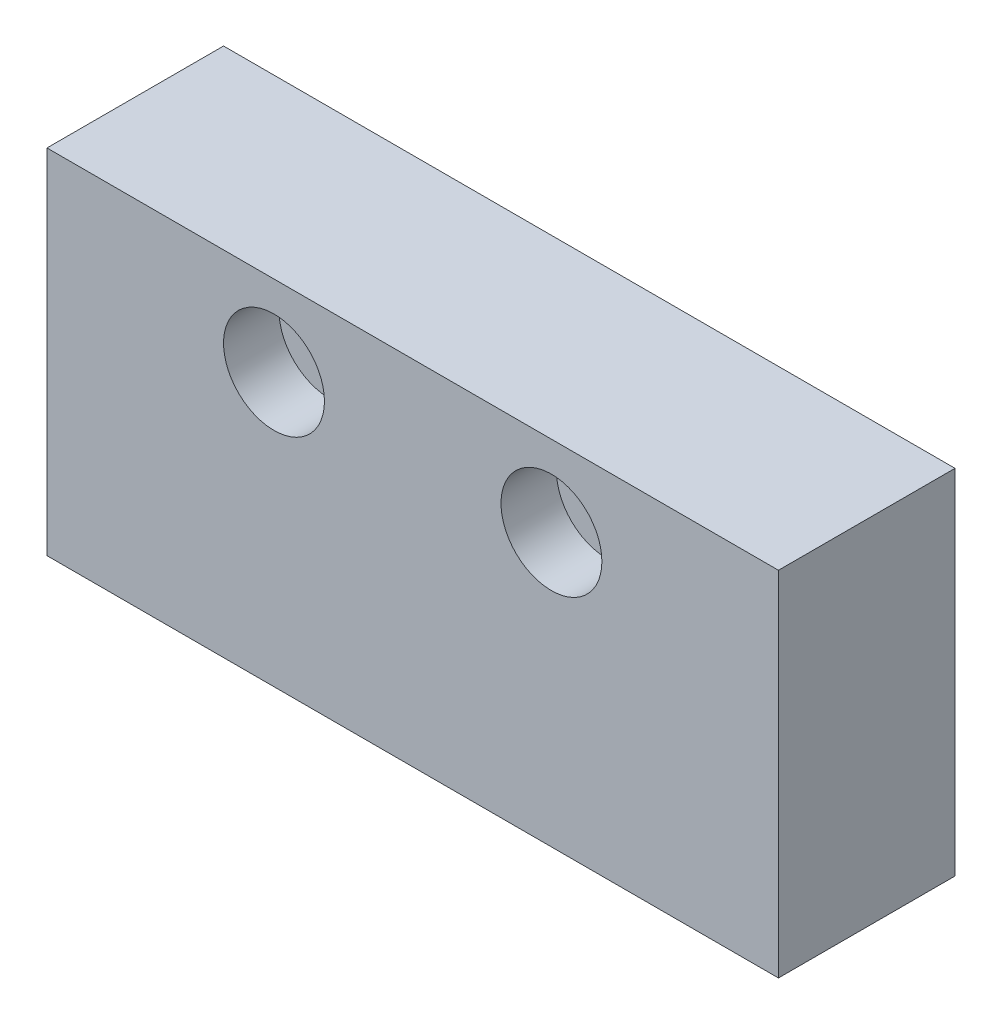
ISO-10303-21;
HEADER;
FILE_DESCRIPTION(('STEP AP214'),'2;1');
FILE_NAME('part.step','',(''),(''),'','','');
FILE_SCHEMA(('AUTOMOTIVE_DESIGN { 1 0 10303 214 1 1 1 1 }'));
ENDSEC;
DATA;
#1=APPLICATION_CONTEXT('core data for automotive mechanical design processes');
#2=APPLICATION_PROTOCOL_DEFINITION('international standard','automotive_design',2000,#1);
#3=PRODUCT_CONTEXT('',#1,'mechanical');
#4=PRODUCT('Part','Part','',(#3));
#5=PRODUCT_RELATED_PRODUCT_CATEGORY('part','',(#4));
#6=PRODUCT_DEFINITION_FORMATION('','',#4);
#7=PRODUCT_DEFINITION_CONTEXT('part definition',#1,'design');
#8=PRODUCT_DEFINITION('design','',#6,#7);
#9=PRODUCT_DEFINITION_SHAPE('','',#8);
#10=(LENGTH_UNIT() NAMED_UNIT(*) SI_UNIT(.MILLI.,.METRE.));
#11=(NAMED_UNIT(*) PLANE_ANGLE_UNIT() SI_UNIT($,.RADIAN.));
#12=(NAMED_UNIT(*) SI_UNIT($,.STERADIAN.) SOLID_ANGLE_UNIT());
#13=UNCERTAINTY_MEASURE_WITH_UNIT(LENGTH_MEASURE(1.E-05),#10,'distance_accuracy_value','');
#14=(GEOMETRIC_REPRESENTATION_CONTEXT(3) GLOBAL_UNCERTAINTY_ASSIGNED_CONTEXT((#13)) GLOBAL_UNIT_ASSIGNED_CONTEXT((#10,
#11,#12)) REPRESENTATION_CONTEXT('',''));
#15=CARTESIAN_POINT('',(0.,0.,0.));
#16=DIRECTION('',(0.,0.,1.));
#17=DIRECTION('',(1.,0.,0.));
#18=AXIS2_PLACEMENT_3D('',#15,#16,#17);
#19=CARTESIAN_POINT('',(29.,-14.,7.));
#20=DIRECTION('',(-1.,0.,0.));
#21=DIRECTION('',(0.,0.,1.));
#22=AXIS2_PLACEMENT_3D('',#19,#20,#21);
#23=PLANE('',#22);
#24=DIRECTION('',(0.,1.,0.));
#25=VECTOR('',#24,1.);
#26=CARTESIAN_POINT('',(29.,-14.,-7.));
#27=LINE('',#26,#25);
#28=CARTESIAN_POINT('',(29.,-14.,-7.));
#29=VERTEX_POINT('',#28);
#30=CARTESIAN_POINT('',(29.,14.,-7.));
#31=VERTEX_POINT('',#30);
#32=EDGE_CURVE('E99',#29,#31,#27,.T.);
#33=ORIENTED_EDGE('',*,*,#32,.T.);
#34=DIRECTION('',(0.,0.,-1.));
#35=VECTOR('',#34,1.);
#36=CARTESIAN_POINT('',(29.,14.,7.));
#37=LINE('',#36,#35);
#38=CARTESIAN_POINT('',(29.,14.,7.));
#39=VERTEX_POINT('',#38);
#40=EDGE_CURVE('E11',#39,#31,#37,.T.);
#41=ORIENTED_EDGE('',*,*,#40,.F.);
#42=DIRECTION('',(0.,1.,0.));
#43=VECTOR('',#42,1.);
#44=CARTESIAN_POINT('',(29.,-14.,7.));
#45=LINE('',#44,#43);
#46=CARTESIAN_POINT('',(29.,-14.,7.));
#47=VERTEX_POINT('',#46);
#48=EDGE_CURVE('E87',#47,#39,#45,.T.);
#49=ORIENTED_EDGE('',*,*,#48,.F.);
#50=DIRECTION('',(0.,0.,-1.));
#51=VECTOR('',#50,1.);
#52=CARTESIAN_POINT('',(29.,-14.,7.));
#53=LINE('',#52,#51);
#54=EDGE_CURVE('E95',#47,#29,#53,.T.);
#55=ORIENTED_EDGE('',*,*,#54,.T.);
#56=EDGE_LOOP('',(#33,#41,#49,#55));
#57=FACE_BOUND('',#56,.T.);
#58=ADVANCED_FACE('F36',(#57),#23,.F.);
#59=CARTESIAN_POINT('',(-29.,14.,7.));
#60=DIRECTION('',(0.,-1.,0.));
#61=DIRECTION('',(0.,0.,-1.));
#62=AXIS2_PLACEMENT_3D('',#59,#60,#61);
#63=PLANE('',#62);
#64=DIRECTION('',(-1.,0.,0.));
#65=VECTOR('',#64,1.);
#66=CARTESIAN_POINT('',(-29.,14.,-7.));
#67=LINE('',#66,#65);
#68=CARTESIAN_POINT('',(-29.,14.,-7.));
#69=VERTEX_POINT('',#68);
#70=EDGE_CURVE('E91',#31,#69,#67,.T.);
#71=ORIENTED_EDGE('',*,*,#70,.T.);
#72=DIRECTION('',(0.,0.,-1.));
#73=VECTOR('',#72,1.);
#74=CARTESIAN_POINT('',(-29.,14.,7.));
#75=LINE('',#74,#73);
#76=CARTESIAN_POINT('',(-29.,14.,7.));
#77=VERTEX_POINT('',#76);
#78=EDGE_CURVE('E44',#77,#69,#75,.T.);
#79=ORIENTED_EDGE('',*,*,#78,.F.);
#80=DIRECTION('',(-1.,0.,0.));
#81=VECTOR('',#80,1.);
#82=CARTESIAN_POINT('',(-29.,14.,7.));
#83=LINE('',#82,#81);
#84=EDGE_CURVE('E82',#39,#77,#83,.T.);
#85=ORIENTED_EDGE('',*,*,#84,.F.);
#86=ORIENTED_EDGE('',*,*,#40,.T.);
#87=EDGE_LOOP('',(#71,#79,#85,#86));
#88=FACE_BOUND('',#87,.T.);
#89=ADVANCED_FACE('F90',(#88),#63,.F.);
#90=CARTESIAN_POINT('',(-29.,-14.,7.));
#91=DIRECTION('',(1.,0.,0.));
#92=DIRECTION('',(0.,0.,-1.));
#93=AXIS2_PLACEMENT_3D('',#90,#91,#92);
#94=PLANE('',#93);
#95=DIRECTION('',(0.,-1.,0.));
#96=VECTOR('',#95,1.);
#97=CARTESIAN_POINT('',(-29.,-14.,-7.));
#98=LINE('',#97,#96);
#99=CARTESIAN_POINT('',(-29.,-14.,-7.));
#100=VERTEX_POINT('',#99);
#101=EDGE_CURVE('E69',#69,#100,#98,.T.);
#102=ORIENTED_EDGE('',*,*,#101,.T.);
#103=DIRECTION('',(0.,0.,-1.));
#104=VECTOR('',#103,1.);
#105=CARTESIAN_POINT('',(-29.,-14.,7.));
#106=LINE('',#105,#104);
#107=CARTESIAN_POINT('',(-29.,-14.,7.));
#108=VERTEX_POINT('',#107);
#109=EDGE_CURVE('E92',#108,#100,#106,.T.);
#110=ORIENTED_EDGE('',*,*,#109,.F.);
#111=DIRECTION('',(0.,-1.,0.));
#112=VECTOR('',#111,1.);
#113=CARTESIAN_POINT('',(-29.,-14.,7.));
#114=LINE('',#113,#112);
#115=EDGE_CURVE('E85',#77,#108,#114,.T.);
#116=ORIENTED_EDGE('',*,*,#115,.F.);
#117=ORIENTED_EDGE('',*,*,#78,.T.);
#118=EDGE_LOOP('',(#102,#110,#116,#117));
#119=FACE_BOUND('',#118,.T.);
#120=ADVANCED_FACE('F93',(#119),#94,.F.);
#121=CARTESIAN_POINT('',(-29.,-14.,7.));
#122=DIRECTION('',(0.,1.,0.));
#123=DIRECTION('',(0.,0.,1.));
#124=AXIS2_PLACEMENT_3D('',#121,#122,#123);
#125=PLANE('',#124);
#126=DIRECTION('',(1.,0.,0.));
#127=VECTOR('',#126,1.);
#128=CARTESIAN_POINT('',(-29.,-14.,-7.));
#129=LINE('',#128,#127);
#130=EDGE_CURVE('E75',#100,#29,#129,.T.);
#131=ORIENTED_EDGE('',*,*,#130,.T.);
#132=ORIENTED_EDGE('',*,*,#54,.F.);
#133=DIRECTION('',(1.,0.,0.));
#134=VECTOR('',#133,1.);
#135=CARTESIAN_POINT('',(-29.,-14.,7.));
#136=LINE('',#135,#134);
#137=EDGE_CURVE('E52',#108,#47,#136,.T.);
#138=ORIENTED_EDGE('',*,*,#137,.F.);
#139=ORIENTED_EDGE('',*,*,#109,.T.);
#140=EDGE_LOOP('',(#131,#132,#138,#139));
#141=FACE_BOUND('',#140,.T.);
#142=ADVANCED_FACE('F107',(#141),#125,.F.);
#143=CARTESIAN_POINT('',(0.,0.,7.));
#144=DIRECTION('',(0.,0.,-1.));
#145=DIRECTION('',(-1.,0.,0.));
#146=AXIS2_PLACEMENT_3D('',#143,#144,#145);
#147=PLANE('',#146);
#148=CARTESIAN_POINT('',(-11.,7.6,7.));
#149=DIRECTION('',(0.,0.,1.));
#150=DIRECTION('',(1.,0.,0.));
#151=AXIS2_PLACEMENT_3D('',#148,#149,#150);
#152=CIRCLE('',#151,4.);
#153=CARTESIAN_POINT('',(-7.,7.6,7.));
#154=VERTEX_POINT('',#153);
#155=EDGE_CURVE('E133',#154,#154,#152,.T.);
#156=ORIENTED_EDGE('',*,*,#155,.F.);
#157=EDGE_LOOP('',(#156));
#158=FACE_BOUND('',#157,.T.);
#159=CARTESIAN_POINT('',(11.,7.6,7.));
#160=DIRECTION('',(0.,0.,1.));
#161=DIRECTION('',(1.,0.,0.));
#162=AXIS2_PLACEMENT_3D('',#159,#160,#161);
#163=CIRCLE('',#162,4.);
#164=CARTESIAN_POINT('',(15.,7.6,7.));
#165=VERTEX_POINT('',#164);
#166=EDGE_CURVE('E121',#165,#165,#163,.T.);
#167=ORIENTED_EDGE('',*,*,#166,.F.);
#168=EDGE_LOOP('',(#167));
#169=FACE_BOUND('',#168,.T.);
#170=ORIENTED_EDGE('',*,*,#48,.T.);
#171=ORIENTED_EDGE('',*,*,#84,.T.);
#172=ORIENTED_EDGE('',*,*,#115,.T.);
#173=ORIENTED_EDGE('',*,*,#137,.T.);
#174=EDGE_LOOP('',(#170,#171,#172,#173));
#175=FACE_BOUND('',#174,.T.);
#176=ADVANCED_FACE('F83',(#158,#169,#175),#147,.F.);
#177=CARTESIAN_POINT('',(0.,0.,-7.));
#178=DIRECTION('',(0.,0.,-1.));
#179=DIRECTION('',(-1.,0.,0.));
#180=AXIS2_PLACEMENT_3D('',#177,#178,#179);
#181=PLANE('',#180);
#182=CARTESIAN_POINT('',(-11.,7.6,-7.));
#183=DIRECTION('',(0.,0.,1.));
#184=DIRECTION('',(1.,0.,0.));
#185=AXIS2_PLACEMENT_3D('',#182,#183,#184);
#186=CIRCLE('',#185,2.15);
#187=CARTESIAN_POINT('',(-8.85,7.6,-7.));
#188=VERTEX_POINT('',#187);
#189=EDGE_CURVE('E124',#188,#188,#186,.T.);
#190=ORIENTED_EDGE('',*,*,#189,.T.);
#191=EDGE_LOOP('',(#190));
#192=FACE_BOUND('',#191,.T.);
#193=CARTESIAN_POINT('',(11.,7.6,-7.));
#194=DIRECTION('',(0.,0.,1.));
#195=DIRECTION('',(1.,0.,0.));
#196=AXIS2_PLACEMENT_3D('',#193,#194,#195);
#197=CIRCLE('',#196,2.15);
#198=CARTESIAN_POINT('',(13.15,7.6,-7.));
#199=VERTEX_POINT('',#198);
#200=EDGE_CURVE('E102',#199,#199,#197,.T.);
#201=ORIENTED_EDGE('',*,*,#200,.T.);
#202=EDGE_LOOP('',(#201));
#203=FACE_BOUND('',#202,.T.);
#204=ORIENTED_EDGE('',*,*,#32,.F.);
#205=ORIENTED_EDGE('',*,*,#130,.F.);
#206=ORIENTED_EDGE('',*,*,#101,.F.);
#207=ORIENTED_EDGE('',*,*,#70,.F.);
#208=EDGE_LOOP('',(#204,#205,#206,#207));
#209=FACE_BOUND('',#208,.T.);
#210=ADVANCED_FACE('F110',(#192,#203,#209),#181,.T.);
#211=CARTESIAN_POINT('',(11.,7.6,7.));
#212=DIRECTION('',(0.,0.,1.));
#213=DIRECTION('',(1.,0.,0.));
#214=AXIS2_PLACEMENT_3D('',#211,#212,#213);
#215=CYLINDRICAL_SURFACE('',#214,2.15);
#216=ORIENTED_EDGE('',*,*,#200,.F.);
#217=EDGE_LOOP('',(#216));
#218=FACE_BOUND('',#217,.T.);
#219=CARTESIAN_POINT('',(11.,7.6,2.6));
#220=DIRECTION('',(0.,0.,1.));
#221=DIRECTION('',(1.,0.,0.));
#222=AXIS2_PLACEMENT_3D('',#219,#220,#221);
#223=CIRCLE('',#222,2.15);
#224=CARTESIAN_POINT('',(13.15,7.6,2.6));
#225=VERTEX_POINT('',#224);
#226=EDGE_CURVE('E115',#225,#225,#223,.T.);
#227=ORIENTED_EDGE('',*,*,#226,.T.);
#228=EDGE_LOOP('',(#227));
#229=FACE_BOUND('',#228,.T.);
#230=ADVANCED_FACE('F157',(#218,#229),#215,.F.);
#231=CARTESIAN_POINT('',(13.15,7.6,2.6));
#232=DIRECTION('',(0.,0.,-1.));
#233=DIRECTION('',(-1.,0.,0.));
#234=AXIS2_PLACEMENT_3D('',#231,#232,#233);
#235=PLANE('',#234);
#236=ORIENTED_EDGE('',*,*,#226,.F.);
#237=EDGE_LOOP('',(#236));
#238=FACE_BOUND('',#237,.T.);
#239=CARTESIAN_POINT('',(11.,7.6,2.6));
#240=DIRECTION('',(0.,0.,1.));
#241=DIRECTION('',(1.,0.,0.));
#242=AXIS2_PLACEMENT_3D('',#239,#240,#241);
#243=CIRCLE('',#242,4.);
#244=CARTESIAN_POINT('',(15.,7.6,2.6));
#245=VERTEX_POINT('',#244);
#246=EDGE_CURVE('E118',#245,#245,#243,.T.);
#247=ORIENTED_EDGE('',*,*,#246,.T.);
#248=EDGE_LOOP('',(#247));
#249=FACE_BOUND('',#248,.T.);
#250=ADVANCED_FACE('F147',(#238,#249),#235,.F.);
#251=CARTESIAN_POINT('',(11.,7.6,7.));
#252=DIRECTION('',(0.,0.,1.));
#253=DIRECTION('',(1.,0.,0.));
#254=AXIS2_PLACEMENT_3D('',#251,#252,#253);
#255=CYLINDRICAL_SURFACE('',#254,4.);
#256=ORIENTED_EDGE('',*,*,#246,.F.);
#257=EDGE_LOOP('',(#256));
#258=FACE_BOUND('',#257,.T.);
#259=ORIENTED_EDGE('',*,*,#166,.T.);
#260=EDGE_LOOP('',(#259));
#261=FACE_BOUND('',#260,.T.);
#262=ADVANCED_FACE('F144',(#258,#261),#255,.F.);
#263=CARTESIAN_POINT('',(-11.,7.6,7.));
#264=DIRECTION('',(0.,0.,1.));
#265=DIRECTION('',(1.,0.,0.));
#266=AXIS2_PLACEMENT_3D('',#263,#264,#265);
#267=CYLINDRICAL_SURFACE('',#266,2.15);
#268=ORIENTED_EDGE('',*,*,#189,.F.);
#269=EDGE_LOOP('',(#268));
#270=FACE_BOUND('',#269,.T.);
#271=CARTESIAN_POINT('',(-11.,7.6,2.6));
#272=DIRECTION('',(0.,0.,1.));
#273=DIRECTION('',(1.,0.,0.));
#274=AXIS2_PLACEMENT_3D('',#271,#272,#273);
#275=CIRCLE('',#274,2.15);
#276=CARTESIAN_POINT('',(-8.85,7.6,2.6));
#277=VERTEX_POINT('',#276);
#278=EDGE_CURVE('E127',#277,#277,#275,.T.);
#279=ORIENTED_EDGE('',*,*,#278,.T.);
#280=EDGE_LOOP('',(#279));
#281=FACE_BOUND('',#280,.T.);
#282=ADVANCED_FACE('F146',(#270,#281),#267,.F.);
#283=CARTESIAN_POINT('',(-8.85,7.6,2.6));
#284=DIRECTION('',(0.,0.,-1.));
#285=DIRECTION('',(-1.,0.,0.));
#286=AXIS2_PLACEMENT_3D('',#283,#284,#285);
#287=PLANE('',#286);
#288=ORIENTED_EDGE('',*,*,#278,.F.);
#289=EDGE_LOOP('',(#288));
#290=FACE_BOUND('',#289,.T.);
#291=CARTESIAN_POINT('',(-11.,7.6,2.6));
#292=DIRECTION('',(0.,0.,1.));
#293=DIRECTION('',(1.,0.,0.));
#294=AXIS2_PLACEMENT_3D('',#291,#292,#293);
#295=CIRCLE('',#294,4.);
#296=CARTESIAN_POINT('',(-7.,7.6,2.6));
#297=VERTEX_POINT('',#296);
#298=EDGE_CURVE('E130',#297,#297,#295,.T.);
#299=ORIENTED_EDGE('',*,*,#298,.T.);
#300=EDGE_LOOP('',(#299));
#301=FACE_BOUND('',#300,.T.);
#302=ADVANCED_FACE('F154',(#290,#301),#287,.F.);
#303=CARTESIAN_POINT('',(-11.,7.6,7.));
#304=DIRECTION('',(0.,0.,1.));
#305=DIRECTION('',(1.,0.,0.));
#306=AXIS2_PLACEMENT_3D('',#303,#304,#305);
#307=CYLINDRICAL_SURFACE('',#306,4.);
#308=ORIENTED_EDGE('',*,*,#298,.F.);
#309=EDGE_LOOP('',(#308));
#310=FACE_BOUND('',#309,.T.);
#311=ORIENTED_EDGE('',*,*,#155,.T.);
#312=EDGE_LOOP('',(#311));
#313=FACE_BOUND('',#312,.T.);
#314=ADVANCED_FACE('F137',(#310,#313),#307,.F.);
#315=CLOSED_SHELL('',(#58,#89,#120,#142,#176,#210,#230,#250,#262,#282,#302,#314));
#316=MANIFOLD_SOLID_BREP('B2',#315);
#317=ADVANCED_BREP_SHAPE_REPRESENTATION('',(#18,#316),#14);
#318=SHAPE_DEFINITION_REPRESENTATION(#9,#317);
ENDSEC;
END-ISO-10303-21;
